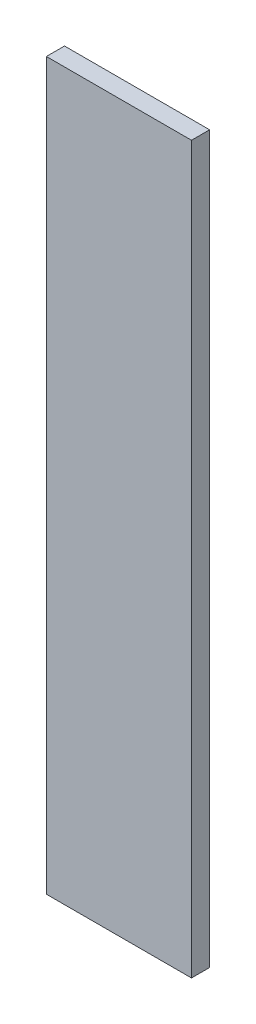
ISO-10303-21;
HEADER;
FILE_DESCRIPTION(('STEP AP214'),'2;1');
FILE_NAME('part.step','',(''),(''),'','','');
FILE_SCHEMA(('AUTOMOTIVE_DESIGN { 1 0 10303 214 1 1 1 1 }'));
ENDSEC;
DATA;
#1=APPLICATION_CONTEXT('core data for automotive mechanical design processes');
#2=APPLICATION_PROTOCOL_DEFINITION('international standard','automotive_design',2000,#1);
#3=PRODUCT_CONTEXT('',#1,'mechanical');
#4=PRODUCT('Part','Part','',(#3));
#5=PRODUCT_RELATED_PRODUCT_CATEGORY('part','',(#4));
#6=PRODUCT_DEFINITION_FORMATION('','',#4);
#7=PRODUCT_DEFINITION_CONTEXT('part definition',#1,'design');
#8=PRODUCT_DEFINITION('design','',#6,#7);
#9=PRODUCT_DEFINITION_SHAPE('','',#8);
#10=(LENGTH_UNIT() NAMED_UNIT(*) SI_UNIT(.MILLI.,.METRE.));
#11=(NAMED_UNIT(*) PLANE_ANGLE_UNIT() SI_UNIT($,.RADIAN.));
#12=(NAMED_UNIT(*) SI_UNIT($,.STERADIAN.) SOLID_ANGLE_UNIT());
#13=UNCERTAINTY_MEASURE_WITH_UNIT(LENGTH_MEASURE(1.E-05),#10,'distance_accuracy_value','');
#14=(GEOMETRIC_REPRESENTATION_CONTEXT(3) GLOBAL_UNCERTAINTY_ASSIGNED_CONTEXT((#13)) GLOBAL_UNIT_ASSIGNED_CONTEXT((#10,
#11,#12)) REPRESENTATION_CONTEXT('',''));
#15=CARTESIAN_POINT('',(0.,0.,0.));
#16=DIRECTION('',(0.,0.,1.));
#17=DIRECTION('',(1.,0.,0.));
#18=AXIS2_PLACEMENT_3D('',#15,#16,#17);
#19=CARTESIAN_POINT('',(25.4,127.,6.35));
#20=DIRECTION('',(-1.,0.,0.));
#21=DIRECTION('',(0.,-1.,0.));
#22=AXIS2_PLACEMENT_3D('',#19,#20,#21);
#23=PLANE('',#22);
#24=DIRECTION('',(0.,1.,0.));
#25=VECTOR('',#24,1.);
#26=CARTESIAN_POINT('',(25.4,127.,0.));
#27=LINE('',#26,#25);
#28=CARTESIAN_POINT('',(25.4,-127.,0.));
#29=VERTEX_POINT('',#28);
#30=CARTESIAN_POINT('',(25.4,127.,0.));
#31=VERTEX_POINT('',#30);
#32=EDGE_CURVE('E100',#29,#31,#27,.T.);
#33=ORIENTED_EDGE('',*,*,#32,.T.);
#34=DIRECTION('',(0.,0.,-1.));
#35=VECTOR('',#34,1.);
#36=CARTESIAN_POINT('',(25.4,127.,6.35));
#37=LINE('',#36,#35);
#38=CARTESIAN_POINT('',(25.4,127.,6.35));
#39=VERTEX_POINT('',#38);
#40=EDGE_CURVE('E11',#39,#31,#37,.T.);
#41=ORIENTED_EDGE('',*,*,#40,.F.);
#42=DIRECTION('',(0.,1.,0.));
#43=VECTOR('',#42,1.);
#44=CARTESIAN_POINT('',(25.4,127.,6.35));
#45=LINE('',#44,#43);
#46=CARTESIAN_POINT('',(25.4,-127.,6.35));
#47=VERTEX_POINT('',#46);
#48=EDGE_CURVE('E88',#47,#39,#45,.T.);
#49=ORIENTED_EDGE('',*,*,#48,.F.);
#50=DIRECTION('',(0.,0.,-1.));
#51=VECTOR('',#50,1.);
#52=CARTESIAN_POINT('',(25.4,-127.,6.35));
#53=LINE('',#52,#51);
#54=EDGE_CURVE('E96',#47,#29,#53,.T.);
#55=ORIENTED_EDGE('',*,*,#54,.T.);
#56=EDGE_LOOP('',(#33,#41,#49,#55));
#57=FACE_BOUND('',#56,.T.);
#58=ADVANCED_FACE('F37',(#57),#23,.F.);
#59=CARTESIAN_POINT('',(-25.4,127.,6.35));
#60=DIRECTION('',(0.,-1.,0.));
#61=DIRECTION('',(0.,0.,-1.));
#62=AXIS2_PLACEMENT_3D('',#59,#60,#61);
#63=PLANE('',#62);
#64=DIRECTION('',(-1.,0.,0.));
#65=VECTOR('',#64,1.);
#66=CARTESIAN_POINT('',(-25.4,127.,0.));
#67=LINE('',#66,#65);
#68=CARTESIAN_POINT('',(-25.4,127.,0.));
#69=VERTEX_POINT('',#68);
#70=EDGE_CURVE('E92',#31,#69,#67,.T.);
#71=ORIENTED_EDGE('',*,*,#70,.T.);
#72=DIRECTION('',(0.,0.,-1.));
#73=VECTOR('',#72,1.);
#74=CARTESIAN_POINT('',(-25.4,127.,6.35));
#75=LINE('',#74,#73);
#76=CARTESIAN_POINT('',(-25.4,127.,6.35));
#77=VERTEX_POINT('',#76);
#78=EDGE_CURVE('E45',#77,#69,#75,.T.);
#79=ORIENTED_EDGE('',*,*,#78,.F.);
#80=DIRECTION('',(-1.,0.,0.));
#81=VECTOR('',#80,1.);
#82=CARTESIAN_POINT('',(-25.4,127.,6.35));
#83=LINE('',#82,#81);
#84=EDGE_CURVE('E83',#39,#77,#83,.T.);
#85=ORIENTED_EDGE('',*,*,#84,.F.);
#86=ORIENTED_EDGE('',*,*,#40,.T.);
#87=EDGE_LOOP('',(#71,#79,#85,#86));
#88=FACE_BOUND('',#87,.T.);
#89=ADVANCED_FACE('F91',(#88),#63,.F.);
#90=CARTESIAN_POINT('',(-25.4,127.,6.35));
#91=DIRECTION('',(1.,0.,0.));
#92=DIRECTION('',(0.,1.,0.));
#93=AXIS2_PLACEMENT_3D('',#90,#91,#92);
#94=PLANE('',#93);
#95=DIRECTION('',(0.,-1.,0.));
#96=VECTOR('',#95,1.);
#97=CARTESIAN_POINT('',(-25.4,127.,0.));
#98=LINE('',#97,#96);
#99=CARTESIAN_POINT('',(-25.4,-127.,0.));
#100=VERTEX_POINT('',#99);
#101=EDGE_CURVE('E70',#69,#100,#98,.T.);
#102=ORIENTED_EDGE('',*,*,#101,.T.);
#103=DIRECTION('',(0.,0.,-1.));
#104=VECTOR('',#103,1.);
#105=CARTESIAN_POINT('',(-25.4,-127.,6.35));
#106=LINE('',#105,#104);
#107=CARTESIAN_POINT('',(-25.4,-127.,6.35));
#108=VERTEX_POINT('',#107);
#109=EDGE_CURVE('E93',#108,#100,#106,.T.);
#110=ORIENTED_EDGE('',*,*,#109,.F.);
#111=DIRECTION('',(0.,-1.,0.));
#112=VECTOR('',#111,1.);
#113=CARTESIAN_POINT('',(-25.4,127.,6.35));
#114=LINE('',#113,#112);
#115=EDGE_CURVE('E86',#77,#108,#114,.T.);
#116=ORIENTED_EDGE('',*,*,#115,.F.);
#117=ORIENTED_EDGE('',*,*,#78,.T.);
#118=EDGE_LOOP('',(#102,#110,#116,#117));
#119=FACE_BOUND('',#118,.T.);
#120=ADVANCED_FACE('F94',(#119),#94,.F.);
#121=CARTESIAN_POINT('',(-25.4,-127.,6.35));
#122=DIRECTION('',(0.,1.,0.));
#123=DIRECTION('',(0.,0.,1.));
#124=AXIS2_PLACEMENT_3D('',#121,#122,#123);
#125=PLANE('',#124);
#126=DIRECTION('',(1.,0.,0.));
#127=VECTOR('',#126,1.);
#128=CARTESIAN_POINT('',(-25.4,-127.,0.));
#129=LINE('',#128,#127);
#130=EDGE_CURVE('E76',#100,#29,#129,.T.);
#131=ORIENTED_EDGE('',*,*,#130,.T.);
#132=ORIENTED_EDGE('',*,*,#54,.F.);
#133=DIRECTION('',(1.,0.,0.));
#134=VECTOR('',#133,1.);
#135=CARTESIAN_POINT('',(-25.4,-127.,6.35));
#136=LINE('',#135,#134);
#137=EDGE_CURVE('E53',#108,#47,#136,.T.);
#138=ORIENTED_EDGE('',*,*,#137,.F.);
#139=ORIENTED_EDGE('',*,*,#109,.T.);
#140=EDGE_LOOP('',(#131,#132,#138,#139));
#141=FACE_BOUND('',#140,.T.);
#142=ADVANCED_FACE('F107',(#141),#125,.F.);
#143=CARTESIAN_POINT('',(0.,0.,6.35));
#144=DIRECTION('',(0.,0.,1.));
#145=DIRECTION('',(1.,0.,0.));
#146=AXIS2_PLACEMENT_3D('',#143,#144,#145);
#147=PLANE('',#146);
#148=ORIENTED_EDGE('',*,*,#48,.T.);
#149=ORIENTED_EDGE('',*,*,#84,.T.);
#150=ORIENTED_EDGE('',*,*,#115,.T.);
#151=ORIENTED_EDGE('',*,*,#137,.T.);
#152=EDGE_LOOP('',(#148,#149,#150,#151));
#153=FACE_BOUND('',#152,.T.);
#154=ADVANCED_FACE('F84',(#153),#147,.T.);
#155=CARTESIAN_POINT('',(0.,0.,0.));
#156=DIRECTION('',(0.,0.,1.));
#157=DIRECTION('',(1.,0.,0.));
#158=AXIS2_PLACEMENT_3D('',#155,#156,#157);
#159=PLANE('',#158);
#160=ORIENTED_EDGE('',*,*,#32,.F.);
#161=ORIENTED_EDGE('',*,*,#130,.F.);
#162=ORIENTED_EDGE('',*,*,#101,.F.);
#163=ORIENTED_EDGE('',*,*,#70,.F.);
#164=EDGE_LOOP('',(#160,#161,#162,#163));
#165=FACE_BOUND('',#164,.T.);
#166=ADVANCED_FACE('F110',(#165),#159,.F.);
#167=CLOSED_SHELL('',(#58,#89,#120,#142,#154,#166));
#168=MANIFOLD_SOLID_BREP('B2',#167);
#169=ADVANCED_BREP_SHAPE_REPRESENTATION('',(#18,#168),#14);
#170=SHAPE_DEFINITION_REPRESENTATION(#9,#169);
ENDSEC;
END-ISO-10303-21;
